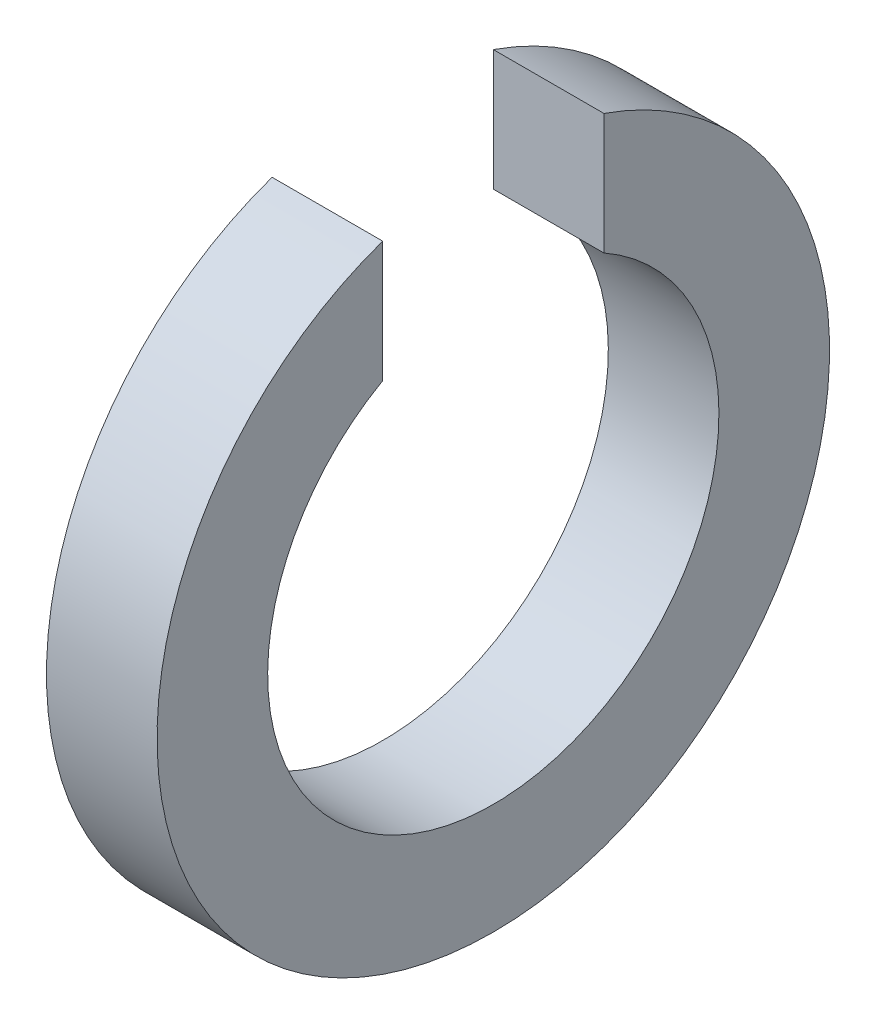
ISO-10303-21;
HEADER;
FILE_DESCRIPTION(('STEP AP214'),'2;1');
FILE_NAME('part.step','',(''),(''),'','','');
FILE_SCHEMA(('AUTOMOTIVE_DESIGN { 1 0 10303 214 1 1 1 1 }'));
ENDSEC;
DATA;
#1=APPLICATION_CONTEXT('core data for automotive mechanical design processes');
#2=APPLICATION_PROTOCOL_DEFINITION('international standard','automotive_design',2000,#1);
#3=PRODUCT_CONTEXT('',#1,'mechanical');
#4=PRODUCT('Part','Part','',(#3));
#5=PRODUCT_RELATED_PRODUCT_CATEGORY('part','',(#4));
#6=PRODUCT_DEFINITION_FORMATION('','',#4);
#7=PRODUCT_DEFINITION_CONTEXT('part definition',#1,'design');
#8=PRODUCT_DEFINITION('design','',#6,#7);
#9=PRODUCT_DEFINITION_SHAPE('','',#8);
#10=(LENGTH_UNIT() NAMED_UNIT(*) SI_UNIT(.MILLI.,.METRE.));
#11=(NAMED_UNIT(*) PLANE_ANGLE_UNIT() SI_UNIT($,.RADIAN.));
#12=(NAMED_UNIT(*) SI_UNIT($,.STERADIAN.) SOLID_ANGLE_UNIT());
#13=UNCERTAINTY_MEASURE_WITH_UNIT(LENGTH_MEASURE(1.E-05),#10,'distance_accuracy_value','');
#14=(GEOMETRIC_REPRESENTATION_CONTEXT(3) GLOBAL_UNCERTAINTY_ASSIGNED_CONTEXT((#13)) GLOBAL_UNIT_ASSIGNED_CONTEXT((#10,
#11,#12)) REPRESENTATION_CONTEXT('',''));
#15=CARTESIAN_POINT('',(0.,0.,0.));
#16=DIRECTION('',(0.,0.,1.));
#17=DIRECTION('',(1.,0.,0.));
#18=AXIS2_PLACEMENT_3D('',#15,#16,#17);
#19=CARTESIAN_POINT('',(-1.25,5.1,0.));
#20=DIRECTION('',(1.,0.,0.));
#21=DIRECTION('',(0.,0.,-1.));
#22=AXIS2_PLACEMENT_3D('',#19,#20,#21);
#23=PLANE('',#22);
#24=CARTESIAN_POINT('',(-1.25,0.,0.));
#25=DIRECTION('',(-1.,0.,0.));
#26=DIRECTION('',(0.,0.,1.));
#27=AXIS2_PLACEMENT_3D('',#24,#25,#26);
#28=CIRCLE('',#27,5.1);
#29=CARTESIAN_POINT('',(-1.25,4.44522215417858,-2.5));
#30=VERTEX_POINT('',#29);
#31=CARTESIAN_POINT('',(-1.25,4.44522215417858,2.5));
#32=VERTEX_POINT('',#31);
#33=EDGE_CURVE('E11',#30,#32,#28,.T.);
#34=ORIENTED_EDGE('',*,*,#33,.F.);
#35=DIRECTION('',(0.,-1.,0.));
#36=VECTOR('',#35,1.);
#37=CARTESIAN_POINT('',(-1.25,7.17704674639925,-2.5));
#38=LINE('',#37,#36);
#39=CARTESIAN_POINT('',(-1.25,7.17704674639925,-2.5));
#40=VERTEX_POINT('',#39);
#41=EDGE_CURVE('E91',#40,#30,#38,.T.);
#42=ORIENTED_EDGE('',*,*,#41,.F.);
#43=CARTESIAN_POINT('',(-1.25,0.,0.));
#44=DIRECTION('',(-1.,0.,0.));
#45=DIRECTION('',(0.,0.,1.));
#46=AXIS2_PLACEMENT_3D('',#43,#44,#45);
#47=CIRCLE('',#46,7.6);
#48=CARTESIAN_POINT('',(-1.25,7.17704674639925,2.5));
#49=VERTEX_POINT('',#48);
#50=EDGE_CURVE('E95',#40,#49,#47,.T.);
#51=ORIENTED_EDGE('',*,*,#50,.T.);
#52=DIRECTION('',(0.,1.,0.));
#53=VECTOR('',#52,1.);
#54=CARTESIAN_POINT('',(-1.25,7.17704674639925,2.5));
#55=LINE('',#54,#53);
#56=EDGE_CURVE('E59',#32,#49,#55,.T.);
#57=ORIENTED_EDGE('',*,*,#56,.F.);
#58=EDGE_LOOP('',(#34,#42,#51,#57));
#59=FACE_BOUND('',#58,.T.);
#60=ADVANCED_FACE('F37',(#59),#23,.F.);
#61=CARTESIAN_POINT('',(0.,0.,0.));
#62=DIRECTION('',(-1.,0.,0.));
#63=DIRECTION('',(0.,0.,1.));
#64=AXIS2_PLACEMENT_3D('',#61,#62,#63);
#65=CYLINDRICAL_SURFACE('',#64,5.1);
#66=CARTESIAN_POINT('',(1.25,0.,0.));
#67=DIRECTION('',(-1.,0.,0.));
#68=DIRECTION('',(0.,0.,1.));
#69=AXIS2_PLACEMENT_3D('',#66,#67,#68);
#70=CIRCLE('',#69,5.1);
#71=CARTESIAN_POINT('',(1.25,4.44522215417858,-2.5));
#72=VERTEX_POINT('',#71);
#73=CARTESIAN_POINT('',(1.25,4.44522215417858,2.5));
#74=VERTEX_POINT('',#73);
#75=EDGE_CURVE('E44',#72,#74,#70,.T.);
#76=ORIENTED_EDGE('',*,*,#75,.F.);
#77=DIRECTION('',(1.,0.,0.));
#78=VECTOR('',#77,1.);
#79=CARTESIAN_POINT('',(-1.251,4.44522215417858,-2.5));
#80=LINE('',#79,#78);
#81=EDGE_CURVE('E101',#30,#72,#80,.T.);
#82=ORIENTED_EDGE('',*,*,#81,.F.);
#83=ORIENTED_EDGE('',*,*,#33,.T.);
#84=DIRECTION('',(1.,0.,0.));
#85=VECTOR('',#84,1.);
#86=CARTESIAN_POINT('',(-1.251,4.44522215417858,2.5));
#87=LINE('',#86,#85);
#88=EDGE_CURVE('E83',#32,#74,#87,.T.);
#89=ORIENTED_EDGE('',*,*,#88,.T.);
#90=EDGE_LOOP('',(#76,#82,#83,#89));
#91=FACE_BOUND('',#90,.T.);
#92=ADVANCED_FACE('F111',(#91),#65,.F.);
#93=CARTESIAN_POINT('',(1.25,5.1,0.));
#94=DIRECTION('',(-1.,0.,0.));
#95=DIRECTION('',(0.,0.,1.));
#96=AXIS2_PLACEMENT_3D('',#93,#94,#95);
#97=PLANE('',#96);
#98=CARTESIAN_POINT('',(1.25,0.,0.));
#99=DIRECTION('',(-1.,0.,0.));
#100=DIRECTION('',(0.,0.,1.));
#101=AXIS2_PLACEMENT_3D('',#98,#99,#100);
#102=CIRCLE('',#101,7.6);
#103=CARTESIAN_POINT('',(1.25,7.17704674639925,-2.5));
#104=VERTEX_POINT('',#103);
#105=CARTESIAN_POINT('',(1.25,7.17704674639925,2.5));
#106=VERTEX_POINT('',#105);
#107=EDGE_CURVE('E89',#104,#106,#102,.T.);
#108=ORIENTED_EDGE('',*,*,#107,.F.);
#109=DIRECTION('',(0.,1.,0.));
#110=VECTOR('',#109,1.);
#111=CARTESIAN_POINT('',(1.25,7.17704674639925,-2.5));
#112=LINE('',#111,#110);
#113=EDGE_CURVE('E51',#72,#104,#112,.T.);
#114=ORIENTED_EDGE('',*,*,#113,.F.);
#115=ORIENTED_EDGE('',*,*,#75,.T.);
#116=DIRECTION('',(0.,-1.,0.));
#117=VECTOR('',#116,1.);
#118=CARTESIAN_POINT('',(1.25,7.17704674639925,2.5));
#119=LINE('',#118,#117);
#120=EDGE_CURVE('E77',#106,#74,#119,.T.);
#121=ORIENTED_EDGE('',*,*,#120,.F.);
#122=EDGE_LOOP('',(#108,#114,#115,#121));
#123=FACE_BOUND('',#122,.T.);
#124=ADVANCED_FACE('F88',(#123),#97,.F.);
#125=CARTESIAN_POINT('',(0.,0.,0.));
#126=DIRECTION('',(-1.,0.,0.));
#127=DIRECTION('',(0.,0.,1.));
#128=AXIS2_PLACEMENT_3D('',#125,#126,#127);
#129=CYLINDRICAL_SURFACE('',#128,7.6);
#130=ORIENTED_EDGE('',*,*,#50,.F.);
#131=DIRECTION('',(1.,0.,0.));
#132=VECTOR('',#131,1.);
#133=CARTESIAN_POINT('',(-1.251,7.17704674639925,-2.5));
#134=LINE('',#133,#132);
#135=EDGE_CURVE('E94',#40,#104,#134,.T.);
#136=ORIENTED_EDGE('',*,*,#135,.T.);
#137=ORIENTED_EDGE('',*,*,#107,.T.);
#138=DIRECTION('',(1.,0.,0.));
#139=VECTOR('',#138,1.);
#140=CARTESIAN_POINT('',(-1.251,7.17704674639925,2.5));
#141=LINE('',#140,#139);
#142=EDGE_CURVE('E74',#49,#106,#141,.T.);
#143=ORIENTED_EDGE('',*,*,#142,.F.);
#144=EDGE_LOOP('',(#130,#136,#137,#143));
#145=FACE_BOUND('',#144,.T.);
#146=ADVANCED_FACE('F93',(#145),#129,.T.);
#147=CARTESIAN_POINT('',(-1.251,7.17704674639925,2.5));
#148=DIRECTION('',(0.,0.,1.));
#149=DIRECTION('',(0.,-1.,0.));
#150=AXIS2_PLACEMENT_3D('',#147,#148,#149);
#151=PLANE('',#150);
#152=ORIENTED_EDGE('',*,*,#56,.T.);
#153=ORIENTED_EDGE('',*,*,#142,.T.);
#154=ORIENTED_EDGE('',*,*,#120,.T.);
#155=ORIENTED_EDGE('',*,*,#88,.F.);
#156=EDGE_LOOP('',(#152,#153,#154,#155));
#157=FACE_BOUND('',#156,.T.);
#158=ADVANCED_FACE('F76',(#157),#151,.F.);
#159=CARTESIAN_POINT('',(-1.251,7.17704674639925,-2.5));
#160=DIRECTION('',(0.,0.,-1.));
#161=DIRECTION('',(0.,1.,0.));
#162=AXIS2_PLACEMENT_3D('',#159,#160,#161);
#163=PLANE('',#162);
#164=ORIENTED_EDGE('',*,*,#41,.T.);
#165=ORIENTED_EDGE('',*,*,#81,.T.);
#166=ORIENTED_EDGE('',*,*,#113,.T.);
#167=ORIENTED_EDGE('',*,*,#135,.F.);
#168=EDGE_LOOP('',(#164,#165,#166,#167));
#169=FACE_BOUND('',#168,.T.);
#170=ADVANCED_FACE('F107',(#169),#163,.F.);
#171=CLOSED_SHELL('',(#60,#92,#124,#146,#158,#170));
#172=MANIFOLD_SOLID_BREP('B2',#171);
#173=ADVANCED_BREP_SHAPE_REPRESENTATION('',(#18,#172),#14);
#174=SHAPE_DEFINITION_REPRESENTATION(#9,#173);
ENDSEC;
END-ISO-10303-21;
